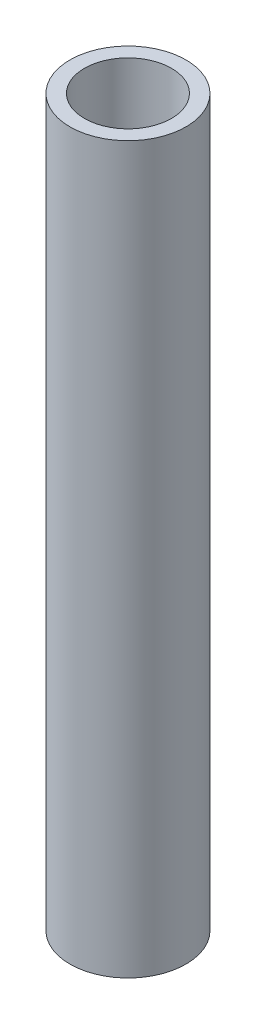
ISO-10303-21;
HEADER;
FILE_DESCRIPTION(('STEP AP214'),'2;1');
FILE_NAME('part.step','',(''),(''),'','','');
FILE_SCHEMA(('AUTOMOTIVE_DESIGN { 1 0 10303 214 1 1 1 1 }'));
ENDSEC;
DATA;
#1=APPLICATION_CONTEXT('core data for automotive mechanical design processes');
#2=APPLICATION_PROTOCOL_DEFINITION('international standard','automotive_design',2000,#1);
#3=PRODUCT_CONTEXT('',#1,'mechanical');
#4=PRODUCT('Part','Part','',(#3));
#5=PRODUCT_RELATED_PRODUCT_CATEGORY('part','',(#4));
#6=PRODUCT_DEFINITION_FORMATION('','',#4);
#7=PRODUCT_DEFINITION_CONTEXT('part definition',#1,'design');
#8=PRODUCT_DEFINITION('design','',#6,#7);
#9=PRODUCT_DEFINITION_SHAPE('','',#8);
#10=(LENGTH_UNIT() NAMED_UNIT(*) SI_UNIT(.MILLI.,.METRE.));
#11=(NAMED_UNIT(*) PLANE_ANGLE_UNIT() SI_UNIT($,.RADIAN.));
#12=(NAMED_UNIT(*) SI_UNIT($,.STERADIAN.) SOLID_ANGLE_UNIT());
#13=UNCERTAINTY_MEASURE_WITH_UNIT(LENGTH_MEASURE(1.E-05),#10,'distance_accuracy_value','');
#14=(GEOMETRIC_REPRESENTATION_CONTEXT(3) GLOBAL_UNCERTAINTY_ASSIGNED_CONTEXT((#13)) GLOBAL_UNIT_ASSIGNED_CONTEXT((#10,
#11,#12)) REPRESENTATION_CONTEXT('',''));
#15=CARTESIAN_POINT('',(0.,0.,0.));
#16=DIRECTION('',(0.,0.,1.));
#17=DIRECTION('',(1.,0.,0.));
#18=AXIS2_PLACEMENT_3D('',#15,#16,#17);
#19=CARTESIAN_POINT('',(0.,0.,0.));
#20=DIRECTION('',(0.,1.,0.));
#21=DIRECTION('',(0.,0.,1.));
#22=AXIS2_PLACEMENT_3D('',#19,#20,#21);
#23=CYLINDRICAL_SURFACE('',#22,4.);
#24=CARTESIAN_POINT('',(0.,50.,0.));
#25=DIRECTION('',(0.,1.,0.));
#26=DIRECTION('',(0.,0.,1.));
#27=AXIS2_PLACEMENT_3D('',#24,#25,#26);
#28=CIRCLE('',#27,4.);
#29=CARTESIAN_POINT('',(0.,50.,4.));
#30=VERTEX_POINT('',#29);
#31=EDGE_CURVE('E52',#30,#30,#28,.T.);
#32=ORIENTED_EDGE('',*,*,#31,.F.);
#33=EDGE_LOOP('',(#32));
#34=FACE_BOUND('',#33,.T.);
#35=CARTESIAN_POINT('',(0.,0.,0.));
#36=DIRECTION('',(0.,1.,0.));
#37=DIRECTION('',(0.,0.,1.));
#38=AXIS2_PLACEMENT_3D('',#35,#36,#37);
#39=CIRCLE('',#38,4.);
#40=CARTESIAN_POINT('',(0.,0.,4.));
#41=VERTEX_POINT('',#40);
#42=EDGE_CURVE('E37',#41,#41,#39,.T.);
#43=ORIENTED_EDGE('',*,*,#42,.T.);
#44=EDGE_LOOP('',(#43));
#45=FACE_BOUND('',#44,.T.);
#46=ADVANCED_FACE('F34',(#34,#45),#23,.T.);
#47=CARTESIAN_POINT('',(0.,0.,0.));
#48=DIRECTION('',(0.,1.,0.));
#49=DIRECTION('',(0.,0.,1.));
#50=AXIS2_PLACEMENT_3D('',#47,#48,#49);
#51=PLANE('',#50);
#52=CARTESIAN_POINT('',(0.,0.,0.));
#53=DIRECTION('',(0.,1.,0.));
#54=DIRECTION('',(0.,0.,1.));
#55=AXIS2_PLACEMENT_3D('',#52,#53,#54);
#56=CIRCLE('',#55,3.);
#57=CARTESIAN_POINT('',(0.,0.,3.));
#58=VERTEX_POINT('',#57);
#59=EDGE_CURVE('E42',#58,#58,#56,.F.);
#60=ORIENTED_EDGE('',*,*,#59,.F.);
#61=EDGE_LOOP('',(#60));
#62=FACE_BOUND('',#61,.T.);
#63=ORIENTED_EDGE('',*,*,#42,.F.);
#64=EDGE_LOOP('',(#63));
#65=FACE_BOUND('',#64,.T.);
#66=ADVANCED_FACE('F70',(#62,#65),#51,.F.);
#67=CARTESIAN_POINT('',(0.,50.,0.));
#68=DIRECTION('',(0.,1.,0.));
#69=DIRECTION('',(0.,0.,1.));
#70=AXIS2_PLACEMENT_3D('',#67,#68,#69);
#71=PLANE('',#70);
#72=CARTESIAN_POINT('',(0.,50.,0.));
#73=DIRECTION('',(0.,1.,0.));
#74=DIRECTION('',(0.,0.,1.));
#75=AXIS2_PLACEMENT_3D('',#72,#73,#74);
#76=CIRCLE('',#75,3.);
#77=CARTESIAN_POINT('',(0.,50.,3.));
#78=VERTEX_POINT('',#77);
#79=EDGE_CURVE('E11',#78,#78,#76,.F.);
#80=ORIENTED_EDGE('',*,*,#79,.T.);
#81=EDGE_LOOP('',(#80));
#82=FACE_BOUND('',#81,.T.);
#83=ORIENTED_EDGE('',*,*,#31,.T.);
#84=EDGE_LOOP('',(#83));
#85=FACE_BOUND('',#84,.T.);
#86=ADVANCED_FACE('F59',(#82,#85),#71,.T.);
#87=CARTESIAN_POINT('',(0.,0.,0.));
#88=DIRECTION('',(0.,1.,0.));
#89=DIRECTION('',(0.,0.,1.));
#90=AXIS2_PLACEMENT_3D('',#87,#88,#89);
#91=CYLINDRICAL_SURFACE('',#90,3.);
#92=ORIENTED_EDGE('',*,*,#79,.F.);
#93=EDGE_LOOP('',(#92));
#94=FACE_BOUND('',#93,.T.);
#95=ORIENTED_EDGE('',*,*,#59,.T.);
#96=EDGE_LOOP('',(#95));
#97=FACE_BOUND('',#96,.T.);
#98=ADVANCED_FACE('F62',(#94,#97),#91,.F.);
#99=CLOSED_SHELL('',(#46,#66,#86,#98));
#100=MANIFOLD_SOLID_BREP('B2',#99);
#101=ADVANCED_BREP_SHAPE_REPRESENTATION('',(#18,#100),#14);
#102=SHAPE_DEFINITION_REPRESENTATION(#9,#101);
ENDSEC;
END-ISO-10303-21;
